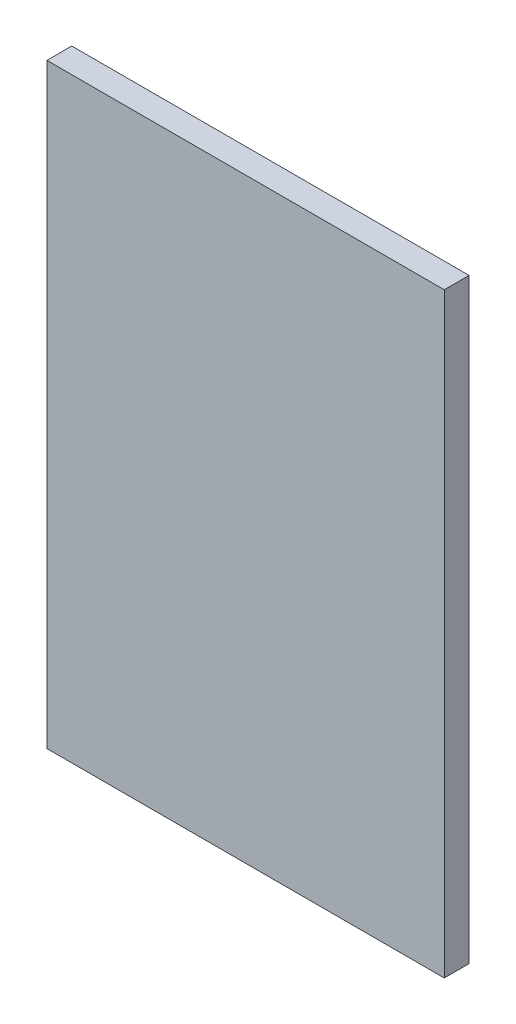
ISO-10303-21;
HEADER;
FILE_DESCRIPTION(('STEP AP214'),'2;1');
FILE_NAME('part.step','',(''),(''),'','','');
FILE_SCHEMA(('AUTOMOTIVE_DESIGN { 1 0 10303 214 1 1 1 1 }'));
ENDSEC;
DATA;
#1=APPLICATION_CONTEXT('core data for automotive mechanical design processes');
#2=APPLICATION_PROTOCOL_DEFINITION('international standard','automotive_design',2000,#1);
#3=PRODUCT_CONTEXT('',#1,'mechanical');
#4=PRODUCT('Part','Part','',(#3));
#5=PRODUCT_RELATED_PRODUCT_CATEGORY('part','',(#4));
#6=PRODUCT_DEFINITION_FORMATION('','',#4);
#7=PRODUCT_DEFINITION_CONTEXT('part definition',#1,'design');
#8=PRODUCT_DEFINITION('design','',#6,#7);
#9=PRODUCT_DEFINITION_SHAPE('','',#8);
#10=(LENGTH_UNIT() NAMED_UNIT(*) SI_UNIT(.MILLI.,.METRE.));
#11=(NAMED_UNIT(*) PLANE_ANGLE_UNIT() SI_UNIT($,.RADIAN.));
#12=(NAMED_UNIT(*) SI_UNIT($,.STERADIAN.) SOLID_ANGLE_UNIT());
#13=UNCERTAINTY_MEASURE_WITH_UNIT(LENGTH_MEASURE(1.E-05),#10,'distance_accuracy_value','');
#14=(GEOMETRIC_REPRESENTATION_CONTEXT(3) GLOBAL_UNCERTAINTY_ASSIGNED_CONTEXT((#13)) GLOBAL_UNIT_ASSIGNED_CONTEXT((#10,
#11,#12)) REPRESENTATION_CONTEXT('',''));
#15=CARTESIAN_POINT('',(0.,0.,0.));
#16=DIRECTION('',(0.,0.,1.));
#17=DIRECTION('',(1.,0.,0.));
#18=AXIS2_PLACEMENT_3D('',#15,#16,#17);
#19=CARTESIAN_POINT('',(0.,0.,3.175));
#20=DIRECTION('',(1.,0.,0.));
#21=DIRECTION('',(0.,0.,-1.));
#22=AXIS2_PLACEMENT_3D('',#19,#20,#21);
#23=PLANE('',#22);
#24=DIRECTION('',(0.,-1.,0.));
#25=VECTOR('',#24,1.);
#26=CARTESIAN_POINT('',(0.,0.,0.));
#27=LINE('',#26,#25);
#28=CARTESIAN_POINT('',(0.,0.,0.));
#29=VERTEX_POINT('',#28);
#30=CARTESIAN_POINT('',(0.,-76.2,0.));
#31=VERTEX_POINT('',#30);
#32=EDGE_CURVE('E96',#29,#31,#27,.T.);
#33=ORIENTED_EDGE('',*,*,#32,.T.);
#34=DIRECTION('',(0.,0.,-1.));
#35=VECTOR('',#34,1.);
#36=CARTESIAN_POINT('',(0.,-76.2,3.175));
#37=LINE('',#36,#35);
#38=CARTESIAN_POINT('',(0.,-76.2,3.175));
#39=VERTEX_POINT('',#38);
#40=EDGE_CURVE('E11',#39,#31,#37,.T.);
#41=ORIENTED_EDGE('',*,*,#40,.F.);
#42=DIRECTION('',(0.,-1.,0.));
#43=VECTOR('',#42,1.);
#44=CARTESIAN_POINT('',(0.,0.,3.175));
#45=LINE('',#44,#43);
#46=CARTESIAN_POINT('',(0.,0.,3.175));
#47=VERTEX_POINT('',#46);
#48=EDGE_CURVE('E84',#47,#39,#45,.T.);
#49=ORIENTED_EDGE('',*,*,#48,.F.);
#50=DIRECTION('',(0.,0.,-1.));
#51=VECTOR('',#50,1.);
#52=CARTESIAN_POINT('',(0.,0.,3.175));
#53=LINE('',#52,#51);
#54=EDGE_CURVE('E92',#47,#29,#53,.T.);
#55=ORIENTED_EDGE('',*,*,#54,.T.);
#56=EDGE_LOOP('',(#33,#41,#49,#55));
#57=FACE_BOUND('',#56,.T.);
#58=ADVANCED_FACE('F33',(#57),#23,.F.);
#59=CARTESIAN_POINT('',(0.,-76.2,3.175));
#60=DIRECTION('',(0.,1.,0.));
#61=DIRECTION('',(0.,0.,1.));
#62=AXIS2_PLACEMENT_3D('',#59,#60,#61);
#63=PLANE('',#62);
#64=DIRECTION('',(1.,0.,0.));
#65=VECTOR('',#64,1.);
#66=CARTESIAN_POINT('',(0.,-76.2,0.));
#67=LINE('',#66,#65);
#68=CARTESIAN_POINT('',(50.8,-76.2,0.));
#69=VERTEX_POINT('',#68);
#70=EDGE_CURVE('E88',#31,#69,#67,.T.);
#71=ORIENTED_EDGE('',*,*,#70,.T.);
#72=DIRECTION('',(0.,0.,-1.));
#73=VECTOR('',#72,1.);
#74=CARTESIAN_POINT('',(50.8,-76.2,3.175));
#75=LINE('',#74,#73);
#76=CARTESIAN_POINT('',(50.8,-76.2,3.175));
#77=VERTEX_POINT('',#76);
#78=EDGE_CURVE('E41',#77,#69,#75,.T.);
#79=ORIENTED_EDGE('',*,*,#78,.F.);
#80=DIRECTION('',(1.,0.,0.));
#81=VECTOR('',#80,1.);
#82=CARTESIAN_POINT('',(0.,-76.2,3.175));
#83=LINE('',#82,#81);
#84=EDGE_CURVE('E79',#39,#77,#83,.T.);
#85=ORIENTED_EDGE('',*,*,#84,.F.);
#86=ORIENTED_EDGE('',*,*,#40,.T.);
#87=EDGE_LOOP('',(#71,#79,#85,#86));
#88=FACE_BOUND('',#87,.T.);
#89=ADVANCED_FACE('F87',(#88),#63,.F.);
#90=CARTESIAN_POINT('',(50.8,0.,3.175));
#91=DIRECTION('',(-1.,0.,0.));
#92=DIRECTION('',(0.,-1.,0.));
#93=AXIS2_PLACEMENT_3D('',#90,#91,#92);
#94=PLANE('',#93);
#95=DIRECTION('',(0.,1.,0.));
#96=VECTOR('',#95,1.);
#97=CARTESIAN_POINT('',(50.8,0.,0.));
#98=LINE('',#97,#96);
#99=CARTESIAN_POINT('',(50.8,0.,0.));
#100=VERTEX_POINT('',#99);
#101=EDGE_CURVE('E66',#69,#100,#98,.T.);
#102=ORIENTED_EDGE('',*,*,#101,.T.);
#103=DIRECTION('',(0.,0.,-1.));
#104=VECTOR('',#103,1.);
#105=CARTESIAN_POINT('',(50.8,0.,3.175));
#106=LINE('',#105,#104);
#107=CARTESIAN_POINT('',(50.8,0.,3.175));
#108=VERTEX_POINT('',#107);
#109=EDGE_CURVE('E89',#108,#100,#106,.T.);
#110=ORIENTED_EDGE('',*,*,#109,.F.);
#111=DIRECTION('',(0.,1.,0.));
#112=VECTOR('',#111,1.);
#113=CARTESIAN_POINT('',(50.8,0.,3.175));
#114=LINE('',#113,#112);
#115=EDGE_CURVE('E82',#77,#108,#114,.T.);
#116=ORIENTED_EDGE('',*,*,#115,.F.);
#117=ORIENTED_EDGE('',*,*,#78,.T.);
#118=EDGE_LOOP('',(#102,#110,#116,#117));
#119=FACE_BOUND('',#118,.T.);
#120=ADVANCED_FACE('F90',(#119),#94,.F.);
#121=CARTESIAN_POINT('',(0.,0.,3.175));
#122=DIRECTION('',(0.,-1.,0.));
#123=DIRECTION('',(0.,0.,-1.));
#124=AXIS2_PLACEMENT_3D('',#121,#122,#123);
#125=PLANE('',#124);
#126=DIRECTION('',(-1.,0.,0.));
#127=VECTOR('',#126,1.);
#128=CARTESIAN_POINT('',(0.,0.,0.));
#129=LINE('',#128,#127);
#130=EDGE_CURVE('E72',#100,#29,#129,.T.);
#131=ORIENTED_EDGE('',*,*,#130,.T.);
#132=ORIENTED_EDGE('',*,*,#54,.F.);
#133=DIRECTION('',(-1.,0.,0.));
#134=VECTOR('',#133,1.);
#135=CARTESIAN_POINT('',(0.,0.,3.175));
#136=LINE('',#135,#134);
#137=EDGE_CURVE('E49',#108,#47,#136,.T.);
#138=ORIENTED_EDGE('',*,*,#137,.F.);
#139=ORIENTED_EDGE('',*,*,#109,.T.);
#140=EDGE_LOOP('',(#131,#132,#138,#139));
#141=FACE_BOUND('',#140,.T.);
#142=ADVANCED_FACE('F103',(#141),#125,.F.);
#143=CARTESIAN_POINT('',(0.,0.,3.175));
#144=DIRECTION('',(0.,0.,1.));
#145=DIRECTION('',(1.,0.,0.));
#146=AXIS2_PLACEMENT_3D('',#143,#144,#145);
#147=PLANE('',#146);
#148=ORIENTED_EDGE('',*,*,#48,.T.);
#149=ORIENTED_EDGE('',*,*,#84,.T.);
#150=ORIENTED_EDGE('',*,*,#115,.T.);
#151=ORIENTED_EDGE('',*,*,#137,.T.);
#152=EDGE_LOOP('',(#148,#149,#150,#151));
#153=FACE_BOUND('',#152,.T.);
#154=ADVANCED_FACE('F80',(#153),#147,.T.);
#155=CARTESIAN_POINT('',(0.,0.,0.));
#156=DIRECTION('',(0.,0.,1.));
#157=DIRECTION('',(1.,0.,0.));
#158=AXIS2_PLACEMENT_3D('',#155,#156,#157);
#159=PLANE('',#158);
#160=ORIENTED_EDGE('',*,*,#32,.F.);
#161=ORIENTED_EDGE('',*,*,#130,.F.);
#162=ORIENTED_EDGE('',*,*,#101,.F.);
#163=ORIENTED_EDGE('',*,*,#70,.F.);
#164=EDGE_LOOP('',(#160,#161,#162,#163));
#165=FACE_BOUND('',#164,.T.);
#166=ADVANCED_FACE('F106',(#165),#159,.F.);
#167=CLOSED_SHELL('',(#58,#89,#120,#142,#154,#166));
#168=MANIFOLD_SOLID_BREP('B2',#167);
#169=ADVANCED_BREP_SHAPE_REPRESENTATION('',(#18,#168),#14);
#170=SHAPE_DEFINITION_REPRESENTATION(#9,#169);
ENDSEC;
END-ISO-10303-21;
